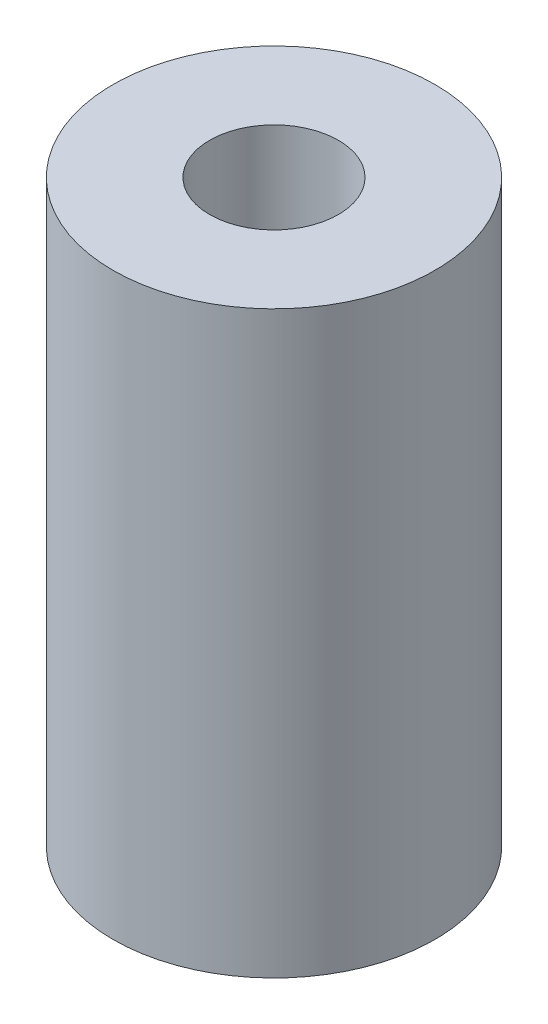
ISO-10303-21;
HEADER;
FILE_DESCRIPTION(('STEP AP214'),'2;1');
FILE_NAME('part.step','',(''),(''),'','','');
FILE_SCHEMA(('AUTOMOTIVE_DESIGN { 1 0 10303 214 1 1 1 1 }'));
ENDSEC;
DATA;
#1=APPLICATION_CONTEXT('core data for automotive mechanical design processes');
#2=APPLICATION_PROTOCOL_DEFINITION('international standard','automotive_design',2000,#1);
#3=PRODUCT_CONTEXT('',#1,'mechanical');
#4=PRODUCT('Part','Part','',(#3));
#5=PRODUCT_RELATED_PRODUCT_CATEGORY('part','',(#4));
#6=PRODUCT_DEFINITION_FORMATION('','',#4);
#7=PRODUCT_DEFINITION_CONTEXT('part definition',#1,'design');
#8=PRODUCT_DEFINITION('design','',#6,#7);
#9=PRODUCT_DEFINITION_SHAPE('','',#8);
#10=(LENGTH_UNIT() NAMED_UNIT(*) SI_UNIT(.MILLI.,.METRE.));
#11=(NAMED_UNIT(*) PLANE_ANGLE_UNIT() SI_UNIT($,.RADIAN.));
#12=(NAMED_UNIT(*) SI_UNIT($,.STERADIAN.) SOLID_ANGLE_UNIT());
#13=UNCERTAINTY_MEASURE_WITH_UNIT(LENGTH_MEASURE(1.E-05),#10,'distance_accuracy_value','');
#14=(GEOMETRIC_REPRESENTATION_CONTEXT(3) GLOBAL_UNCERTAINTY_ASSIGNED_CONTEXT((#13)) GLOBAL_UNIT_ASSIGNED_CONTEXT((#10,
#11,#12)) REPRESENTATION_CONTEXT('',''));
#15=CARTESIAN_POINT('',(0.,0.,0.));
#16=DIRECTION('',(0.,0.,1.));
#17=DIRECTION('',(1.,0.,0.));
#18=AXIS2_PLACEMENT_3D('',#15,#16,#17);
#19=CARTESIAN_POINT('',(0.,9.,0.));
#20=DIRECTION('',(0.,1.,0.));
#21=DIRECTION('',(0.,0.,1.));
#22=AXIS2_PLACEMENT_3D('',#19,#20,#21);
#23=PLANE('',#22);
#24=CARTESIAN_POINT('',(0.,9.,0.));
#25=DIRECTION('',(0.,1.,0.));
#26=DIRECTION('',(0.,0.,1.));
#27=AXIS2_PLACEMENT_3D('',#24,#25,#26);
#28=CIRCLE('',#27,2.5);
#29=CARTESIAN_POINT('',(0.,9.,2.5));
#30=VERTEX_POINT('',#29);
#31=EDGE_CURVE('E10',#30,#30,#28,.T.);
#32=ORIENTED_EDGE('',*,*,#31,.T.);
#33=EDGE_LOOP('',(#32));
#34=FACE_BOUND('',#33,.T.);
#35=CARTESIAN_POINT('',(0.,9.,0.));
#36=DIRECTION('',(0.,1.,0.));
#37=DIRECTION('',(0.,0.,1.));
#38=AXIS2_PLACEMENT_3D('',#35,#36,#37);
#39=CIRCLE('',#38,1.);
#40=CARTESIAN_POINT('',(0.,9.,1.));
#41=VERTEX_POINT('',#40);
#42=EDGE_CURVE('E50',#41,#41,#39,.T.);
#43=ORIENTED_EDGE('',*,*,#42,.F.);
#44=EDGE_LOOP('',(#43));
#45=FACE_BOUND('',#44,.T.);
#46=ADVANCED_FACE('F37',(#34,#45),#23,.T.);
#47=CARTESIAN_POINT('',(0.,0.,0.));
#48=DIRECTION('',(0.,1.,0.));
#49=DIRECTION('',(0.,0.,1.));
#50=AXIS2_PLACEMENT_3D('',#47,#48,#49);
#51=PLANE('',#50);
#52=CARTESIAN_POINT('',(0.,0.,0.));
#53=DIRECTION('',(0.,1.,0.));
#54=DIRECTION('',(0.,0.,1.));
#55=AXIS2_PLACEMENT_3D('',#52,#53,#54);
#56=CIRCLE('',#55,2.5);
#57=CARTESIAN_POINT('',(0.,0.,2.5));
#58=VERTEX_POINT('',#57);
#59=EDGE_CURVE('E41',#58,#58,#56,.T.);
#60=ORIENTED_EDGE('',*,*,#59,.F.);
#61=EDGE_LOOP('',(#60));
#62=FACE_BOUND('',#61,.T.);
#63=CARTESIAN_POINT('',(0.,0.,0.));
#64=DIRECTION('',(0.,1.,0.));
#65=DIRECTION('',(0.,0.,1.));
#66=AXIS2_PLACEMENT_3D('',#63,#64,#65);
#67=CIRCLE('',#66,1.);
#68=CARTESIAN_POINT('',(0.,0.,1.));
#69=VERTEX_POINT('',#68);
#70=EDGE_CURVE('E52',#69,#69,#67,.T.);
#71=ORIENTED_EDGE('',*,*,#70,.T.);
#72=EDGE_LOOP('',(#71));
#73=FACE_BOUND('',#72,.T.);
#74=ADVANCED_FACE('F64',(#62,#73),#51,.F.);
#75=CARTESIAN_POINT('',(0.,9.,0.));
#76=DIRECTION('',(0.,-1.,0.));
#77=DIRECTION('',(0.,0.,-1.));
#78=AXIS2_PLACEMENT_3D('',#75,#76,#77);
#79=CYLINDRICAL_SURFACE('',#78,2.5);
#80=ORIENTED_EDGE('',*,*,#31,.F.);
#81=EDGE_LOOP('',(#80));
#82=FACE_BOUND('',#81,.T.);
#83=ORIENTED_EDGE('',*,*,#59,.T.);
#84=EDGE_LOOP('',(#83));
#85=FACE_BOUND('',#84,.T.);
#86=ADVANCED_FACE('F39',(#82,#85),#79,.T.);
#87=CARTESIAN_POINT('',(0.,9.,0.));
#88=DIRECTION('',(0.,-1.,0.));
#89=DIRECTION('',(0.,0.,-1.));
#90=AXIS2_PLACEMENT_3D('',#87,#88,#89);
#91=CYLINDRICAL_SURFACE('',#90,1.);
#92=ORIENTED_EDGE('',*,*,#42,.T.);
#93=EDGE_LOOP('',(#92));
#94=FACE_BOUND('',#93,.T.);
#95=ORIENTED_EDGE('',*,*,#70,.F.);
#96=EDGE_LOOP('',(#95));
#97=FACE_BOUND('',#96,.T.);
#98=ADVANCED_FACE('F60',(#94,#97),#91,.F.);
#99=CLOSED_SHELL('',(#46,#74,#86,#98));
#100=MANIFOLD_SOLID_BREP('B2',#99);
#101=ADVANCED_BREP_SHAPE_REPRESENTATION('',(#18,#100),#14);
#102=SHAPE_DEFINITION_REPRESENTATION(#9,#101);
ENDSEC;
END-ISO-10303-21;
